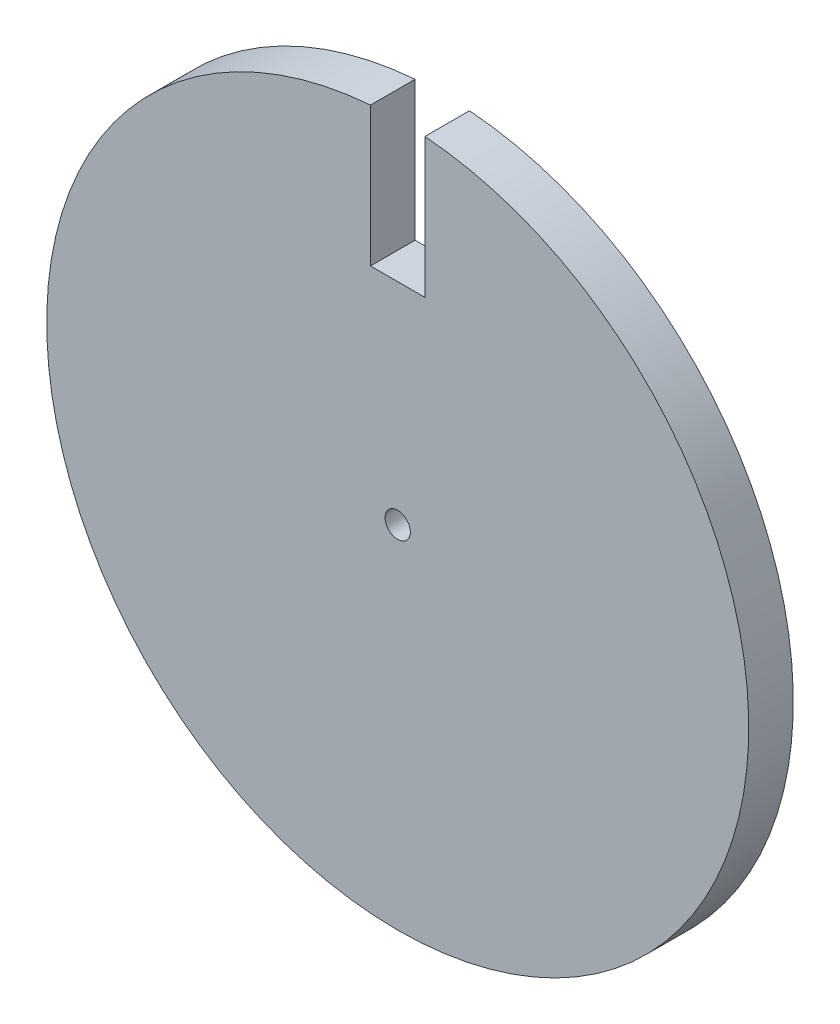
ISO-10303-21;
HEADER;
FILE_DESCRIPTION(('STEP AP214'),'2;1');
FILE_NAME('part.step','',(''),(''),'','','');
FILE_SCHEMA(('AUTOMOTIVE_DESIGN { 1 0 10303 214 1 1 1 1 }'));
ENDSEC;
DATA;
#1=APPLICATION_CONTEXT('core data for automotive mechanical design processes');
#2=APPLICATION_PROTOCOL_DEFINITION('international standard','automotive_design',2000,#1);
#3=PRODUCT_CONTEXT('',#1,'mechanical');
#4=PRODUCT('Part','Part','',(#3));
#5=PRODUCT_RELATED_PRODUCT_CATEGORY('part','',(#4));
#6=PRODUCT_DEFINITION_FORMATION('','',#4);
#7=PRODUCT_DEFINITION_CONTEXT('part definition',#1,'design');
#8=PRODUCT_DEFINITION('design','',#6,#7);
#9=PRODUCT_DEFINITION_SHAPE('','',#8);
#10=(LENGTH_UNIT() NAMED_UNIT(*) SI_UNIT(.MILLI.,.METRE.));
#11=(NAMED_UNIT(*) PLANE_ANGLE_UNIT() SI_UNIT($,.RADIAN.));
#12=(NAMED_UNIT(*) SI_UNIT($,.STERADIAN.) SOLID_ANGLE_UNIT());
#13=UNCERTAINTY_MEASURE_WITH_UNIT(LENGTH_MEASURE(1.E-05),#10,'distance_accuracy_value','');
#14=(GEOMETRIC_REPRESENTATION_CONTEXT(3) GLOBAL_UNCERTAINTY_ASSIGNED_CONTEXT((#13)) GLOBAL_UNIT_ASSIGNED_CONTEXT((#10,
#11,#12)) REPRESENTATION_CONTEXT('',''));
#15=CARTESIAN_POINT('',(0.,0.,0.));
#16=DIRECTION('',(0.,0.,1.));
#17=DIRECTION('',(1.,0.,0.));
#18=AXIS2_PLACEMENT_3D('',#15,#16,#17);
#19=CARTESIAN_POINT('',(0.,0.,1.5875));
#20=DIRECTION('',(0.,0.,1.));
#21=DIRECTION('',(1.,0.,0.));
#22=AXIS2_PLACEMENT_3D('',#19,#20,#21);
#23=PLANE('',#22);
#24=DIRECTION('',(0.,-1.,0.));
#25=VECTOR('',#24,1.);
#26=CARTESIAN_POINT('',(1.93699685119232,34.0447867361601,1.5875));
#27=LINE('',#26,#25);
#28=CARTESIAN_POINT('',(1.93699685119232,24.9248479072285,1.5875));
#29=VERTEX_POINT('',#28);
#30=CARTESIAN_POINT('',(1.93699685119232,15.,1.5875));
#31=VERTEX_POINT('',#30);
#32=EDGE_CURVE('E87',#29,#31,#27,.T.);
#33=ORIENTED_EDGE('',*,*,#32,.T.);
#34=DIRECTION('',(-1.,0.,0.));
#35=VECTOR('',#34,1.);
#36=CARTESIAN_POINT('',(1.93699685119232,15.,1.5875));
#37=LINE('',#36,#35);
#38=CARTESIAN_POINT('',(-1.93699685119232,15.,1.5875));
#39=VERTEX_POINT('',#38);
#40=EDGE_CURVE('E125',#31,#39,#37,.T.);
#41=ORIENTED_EDGE('',*,*,#40,.T.);
#42=DIRECTION('',(0.,1.,0.));
#43=VECTOR('',#42,1.);
#44=CARTESIAN_POINT('',(-1.93699685119232,15.,1.5875));
#45=LINE('',#44,#43);
#46=CARTESIAN_POINT('',(-1.93699685119232,24.9248479072285,1.5875));
#47=VERTEX_POINT('',#46);
#48=EDGE_CURVE('E120',#39,#47,#45,.T.);
#49=ORIENTED_EDGE('',*,*,#48,.T.);
#50=CARTESIAN_POINT('',(0.,0.,1.5875));
#51=DIRECTION('',(0.,0.,1.));
#52=DIRECTION('',(1.,0.,0.));
#53=AXIS2_PLACEMENT_3D('',#50,#51,#52);
#54=CIRCLE('',#53,25.);
#55=EDGE_CURVE('E11',#47,#29,#54,.T.);
#56=ORIENTED_EDGE('',*,*,#55,.T.);
#57=EDGE_LOOP('',(#33,#41,#49,#56));
#58=FACE_BOUND('',#57,.T.);
#59=CARTESIAN_POINT('',(0.,0.,1.5875));
#60=DIRECTION('',(0.,0.,1.));
#61=DIRECTION('',(1.,0.,0.));
#62=AXIS2_PLACEMENT_3D('',#59,#60,#61);
#63=CIRCLE('',#62,0.9);
#64=CARTESIAN_POINT('',(0.9,0.,1.5875));
#65=VERTEX_POINT('',#64);
#66=EDGE_CURVE('E103',#65,#65,#63,.T.);
#67=ORIENTED_EDGE('',*,*,#66,.F.);
#68=EDGE_LOOP('',(#67));
#69=FACE_BOUND('',#68,.T.);
#70=ADVANCED_FACE('F39',(#58,#69),#23,.T.);
#71=CARTESIAN_POINT('',(0.,0.,-1.5875));
#72=DIRECTION('',(0.,0.,1.));
#73=DIRECTION('',(1.,0.,0.));
#74=AXIS2_PLACEMENT_3D('',#71,#72,#73);
#75=PLANE('',#74);
#76=DIRECTION('',(-1.,0.,0.));
#77=VECTOR('',#76,1.);
#78=CARTESIAN_POINT('',(1.93699685119232,15.,-1.5875));
#79=LINE('',#78,#77);
#80=CARTESIAN_POINT('',(1.93699685119232,15.,-1.5875));
#81=VERTEX_POINT('',#80);
#82=CARTESIAN_POINT('',(-1.93699685119232,15.,-1.5875));
#83=VERTEX_POINT('',#82);
#84=EDGE_CURVE('E98',#81,#83,#79,.T.);
#85=ORIENTED_EDGE('',*,*,#84,.F.);
#86=DIRECTION('',(0.,-1.,0.));
#87=VECTOR('',#86,1.);
#88=CARTESIAN_POINT('',(1.93699685119232,34.0447867361601,-1.5875));
#89=LINE('',#88,#87);
#90=CARTESIAN_POINT('',(1.93699685119232,24.9248479072285,-1.5875));
#91=VERTEX_POINT('',#90);
#92=EDGE_CURVE('E84',#91,#81,#89,.T.);
#93=ORIENTED_EDGE('',*,*,#92,.F.);
#94=CARTESIAN_POINT('',(0.,0.,-1.5875));
#95=DIRECTION('',(0.,0.,1.));
#96=DIRECTION('',(1.,0.,0.));
#97=AXIS2_PLACEMENT_3D('',#94,#95,#96);
#98=CIRCLE('',#97,25.);
#99=CARTESIAN_POINT('',(-1.93699685119232,24.9248479072285,-1.5875));
#100=VERTEX_POINT('',#99);
#101=EDGE_CURVE('E43',#100,#91,#98,.T.);
#102=ORIENTED_EDGE('',*,*,#101,.F.);
#103=DIRECTION('',(0.,1.,0.));
#104=VECTOR('',#103,1.);
#105=CARTESIAN_POINT('',(-1.93699685119232,15.,-1.5875));
#106=LINE('',#105,#104);
#107=EDGE_CURVE('E55',#83,#100,#106,.T.);
#108=ORIENTED_EDGE('',*,*,#107,.F.);
#109=EDGE_LOOP('',(#85,#93,#102,#108));
#110=FACE_BOUND('',#109,.T.);
#111=CARTESIAN_POINT('',(0.,0.,-1.5875));
#112=DIRECTION('',(0.,0.,1.));
#113=DIRECTION('',(1.,0.,0.));
#114=AXIS2_PLACEMENT_3D('',#111,#112,#113);
#115=CIRCLE('',#114,0.9);
#116=CARTESIAN_POINT('',(0.9,0.,-1.5875));
#117=VERTEX_POINT('',#116);
#118=EDGE_CURVE('E100',#117,#117,#115,.T.);
#119=ORIENTED_EDGE('',*,*,#118,.T.);
#120=EDGE_LOOP('',(#119));
#121=FACE_BOUND('',#120,.T.);
#122=ADVANCED_FACE('F96',(#110,#121),#75,.F.);
#123=CARTESIAN_POINT('',(0.,0.,1.5875));
#124=DIRECTION('',(0.,0.,-1.));
#125=DIRECTION('',(-1.,0.,0.));
#126=AXIS2_PLACEMENT_3D('',#123,#124,#125);
#127=CYLINDRICAL_SURFACE('',#126,25.);
#128=ORIENTED_EDGE('',*,*,#101,.T.);
#129=DIRECTION('',(0.,0.,-1.));
#130=VECTOR('',#129,1.);
#131=CARTESIAN_POINT('',(1.93699685119232,24.9248479072285,1.5875));
#132=LINE('',#131,#130);
#133=EDGE_CURVE('E80',#29,#91,#132,.T.);
#134=ORIENTED_EDGE('',*,*,#133,.F.);
#135=ORIENTED_EDGE('',*,*,#55,.F.);
#136=DIRECTION('',(0.,0.,-1.));
#137=VECTOR('',#136,1.);
#138=CARTESIAN_POINT('',(-1.93699685119232,24.9248479072285,1.5875));
#139=LINE('',#138,#137);
#140=EDGE_CURVE('E92',#100,#47,#139,.F.);
#141=ORIENTED_EDGE('',*,*,#140,.F.);
#142=EDGE_LOOP('',(#128,#134,#135,#141));
#143=FACE_BOUND('',#142,.T.);
#144=ADVANCED_FACE('F41',(#143),#127,.T.);
#145=CARTESIAN_POINT('',(0.,0.,1.5875));
#146=DIRECTION('',(0.,0.,-1.));
#147=DIRECTION('',(-1.,0.,0.));
#148=AXIS2_PLACEMENT_3D('',#145,#146,#147);
#149=CYLINDRICAL_SURFACE('',#148,0.9);
#150=ORIENTED_EDGE('',*,*,#66,.T.);
#151=EDGE_LOOP('',(#150));
#152=FACE_BOUND('',#151,.T.);
#153=ORIENTED_EDGE('',*,*,#118,.F.);
#154=EDGE_LOOP('',(#153));
#155=FACE_BOUND('',#154,.T.);
#156=ADVANCED_FACE('F151',(#152,#155),#149,.F.);
#157=CARTESIAN_POINT('',(1.93699685119232,15.,1.5895));
#158=DIRECTION('',(0.,-1.,0.));
#159=DIRECTION('',(0.,0.,-1.));
#160=AXIS2_PLACEMENT_3D('',#157,#158,#159);
#161=PLANE('',#160);
#162=DIRECTION('',(0.,0.,-1.));
#163=VECTOR('',#162,1.);
#164=CARTESIAN_POINT('',(1.93699685119232,15.,1.5895));
#165=LINE('',#164,#163);
#166=EDGE_CURVE('E117',#31,#81,#165,.T.);
#167=ORIENTED_EDGE('',*,*,#166,.T.);
#168=ORIENTED_EDGE('',*,*,#84,.T.);
#169=DIRECTION('',(0.,0.,-1.));
#170=VECTOR('',#169,1.);
#171=CARTESIAN_POINT('',(-1.93699685119232,15.,1.5895));
#172=LINE('',#171,#170);
#173=EDGE_CURVE('E60',#39,#83,#172,.T.);
#174=ORIENTED_EDGE('',*,*,#173,.F.);
#175=ORIENTED_EDGE('',*,*,#40,.F.);
#176=EDGE_LOOP('',(#167,#168,#174,#175));
#177=FACE_BOUND('',#176,.T.);
#178=ADVANCED_FACE('F134',(#177),#161,.F.);
#179=CARTESIAN_POINT('',(1.93699685119232,34.0447867361601,1.5895));
#180=DIRECTION('',(1.,0.,0.));
#181=DIRECTION('',(0.,1.,0.));
#182=AXIS2_PLACEMENT_3D('',#179,#180,#181);
#183=PLANE('',#182);
#184=ORIENTED_EDGE('',*,*,#133,.T.);
#185=ORIENTED_EDGE('',*,*,#92,.T.);
#186=ORIENTED_EDGE('',*,*,#166,.F.);
#187=ORIENTED_EDGE('',*,*,#32,.F.);
#188=EDGE_LOOP('',(#184,#185,#186,#187));
#189=FACE_BOUND('',#188,.T.);
#190=ADVANCED_FACE('F82',(#189),#183,.F.);
#191=CARTESIAN_POINT('',(-1.93699685119232,15.,1.5895));
#192=DIRECTION('',(-1.,0.,0.));
#193=DIRECTION('',(0.,-1.,0.));
#194=AXIS2_PLACEMENT_3D('',#191,#192,#193);
#195=PLANE('',#194);
#196=ORIENTED_EDGE('',*,*,#140,.T.);
#197=ORIENTED_EDGE('',*,*,#48,.F.);
#198=ORIENTED_EDGE('',*,*,#173,.T.);
#199=ORIENTED_EDGE('',*,*,#107,.T.);
#200=EDGE_LOOP('',(#196,#197,#198,#199));
#201=FACE_BOUND('',#200,.T.);
#202=ADVANCED_FACE('F137',(#201),#195,.F.);
#203=CLOSED_SHELL('',(#70,#122,#144,#156,#178,#190,#202));
#204=MANIFOLD_SOLID_BREP('B2',#203);
#205=ADVANCED_BREP_SHAPE_REPRESENTATION('',(#18,#204),#14);
#206=SHAPE_DEFINITION_REPRESENTATION(#9,#205);
ENDSEC;
END-ISO-10303-21;
